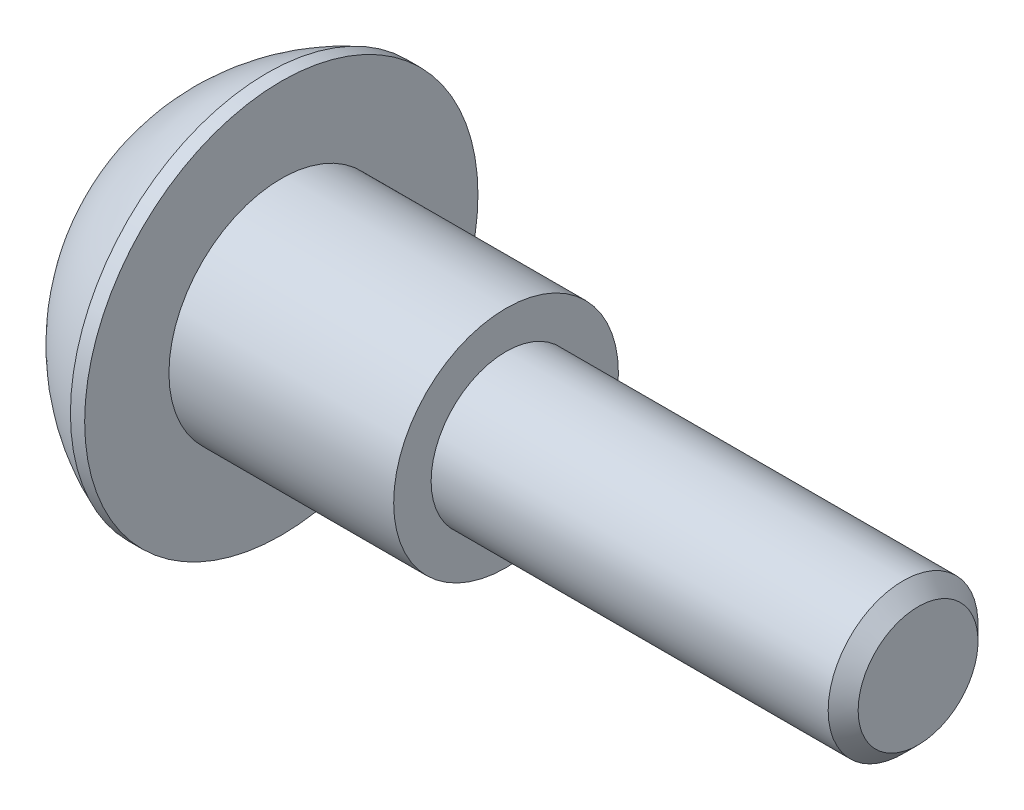
ISO-10303-21;
HEADER;
FILE_DESCRIPTION(('STEP AP214'),'2;1');
FILE_NAME('part.step','',(''),(''),'','','');
FILE_SCHEMA(('AUTOMOTIVE_DESIGN { 1 0 10303 214 1 1 1 1 }'));
ENDSEC;
DATA;
#1=APPLICATION_CONTEXT('core data for automotive mechanical design processes');
#2=APPLICATION_PROTOCOL_DEFINITION('international standard','automotive_design',2000,#1);
#3=PRODUCT_CONTEXT('',#1,'mechanical');
#4=PRODUCT('Part','Part','',(#3));
#5=PRODUCT_RELATED_PRODUCT_CATEGORY('part','',(#4));
#6=PRODUCT_DEFINITION_FORMATION('','',#4);
#7=PRODUCT_DEFINITION_CONTEXT('part definition',#1,'design');
#8=PRODUCT_DEFINITION('design','',#6,#7);
#9=PRODUCT_DEFINITION_SHAPE('','',#8);
#10=(LENGTH_UNIT() NAMED_UNIT(*) SI_UNIT(.MILLI.,.METRE.));
#11=(NAMED_UNIT(*) PLANE_ANGLE_UNIT() SI_UNIT($,.RADIAN.));
#12=(NAMED_UNIT(*) SI_UNIT($,.STERADIAN.) SOLID_ANGLE_UNIT());
#13=UNCERTAINTY_MEASURE_WITH_UNIT(LENGTH_MEASURE(1.E-05),#10,'distance_accuracy_value','');
#14=(GEOMETRIC_REPRESENTATION_CONTEXT(3) GLOBAL_UNCERTAINTY_ASSIGNED_CONTEXT((#13)) GLOBAL_UNIT_ASSIGNED_CONTEXT((#10,
#11,#12)) REPRESENTATION_CONTEXT('',''));
#15=CARTESIAN_POINT('',(0.,0.,0.));
#16=DIRECTION('',(0.,0.,1.));
#17=DIRECTION('',(1.,0.,0.));
#18=AXIS2_PLACEMENT_3D('',#15,#16,#17);
#19=CARTESIAN_POINT('',(0.,0.,0.));
#20=DIRECTION('',(-1.,0.,0.));
#21=DIRECTION('',(0.,0.,1.));
#22=AXIS2_PLACEMENT_3D('',#19,#20,#21);
#23=PLANE('',#22);
#24=CARTESIAN_POINT('',(0.,0.,0.));
#25=DIRECTION('',(-1.,0.,0.));
#26=DIRECTION('',(0.,0.,1.));
#27=AXIS2_PLACEMENT_3D('',#24,#25,#26);
#28=CIRCLE('',#27,2.625);
#29=CARTESIAN_POINT('',(0.,2.625,0.));
#30=VERTEX_POINT('',#29);
#31=EDGE_CURVE('E43',#30,#30,#28,.T.);
#32=ORIENTED_EDGE('',*,*,#31,.T.);
#33=EDGE_LOOP('',(#32));
#34=FACE_BOUND('',#33,.T.);
#35=DIRECTION('',(0.,-1.,0.));
#36=VECTOR('',#35,1.);
#37=CARTESIAN_POINT('',(0.,-1.15470053837925,2.));
#38=LINE('',#37,#36);
#39=CARTESIAN_POINT('',(0.,1.15470053837925,2.));
#40=VERTEX_POINT('',#39);
#41=CARTESIAN_POINT('',(0.,-1.15470053837925,2.));
#42=VERTEX_POINT('',#41);
#43=EDGE_CURVE('E50',#40,#42,#38,.T.);
#44=ORIENTED_EDGE('',*,*,#43,.T.);
#45=DIRECTION('',(0.,-0.500000000000001,-0.866025403784438));
#46=VECTOR('',#45,1.);
#47=CARTESIAN_POINT('',(0.,-2.3094010767585,0.));
#48=LINE('',#47,#46);
#49=CARTESIAN_POINT('',(0.,-2.3094010767585,0.));
#50=VERTEX_POINT('',#49);
#51=EDGE_CURVE('E158',#42,#50,#48,.T.);
#52=ORIENTED_EDGE('',*,*,#51,.T.);
#53=DIRECTION('',(0.,0.500000000000001,-0.866025403784438));
#54=VECTOR('',#53,1.);
#55=CARTESIAN_POINT('',(0.,-1.15470053837925,-2.));
#56=LINE('',#55,#54);
#57=CARTESIAN_POINT('',(0.,-1.15470053837925,-2.));
#58=VERTEX_POINT('',#57);
#59=EDGE_CURVE('E130',#50,#58,#56,.T.);
#60=ORIENTED_EDGE('',*,*,#59,.T.);
#61=DIRECTION('',(0.,1.,0.));
#62=VECTOR('',#61,1.);
#63=CARTESIAN_POINT('',(0.,1.15470053837925,-2.));
#64=LINE('',#63,#62);
#65=CARTESIAN_POINT('',(0.,1.15470053837925,-2.));
#66=VERTEX_POINT('',#65);
#67=EDGE_CURVE('E185',#58,#66,#64,.T.);
#68=ORIENTED_EDGE('',*,*,#67,.T.);
#69=DIRECTION('',(0.,0.5,0.866025403784439));
#70=VECTOR('',#69,1.);
#71=CARTESIAN_POINT('',(0.,2.3094010767585,0.));
#72=LINE('',#71,#70);
#73=CARTESIAN_POINT('',(0.,2.3094010767585,0.));
#74=VERTEX_POINT('',#73);
#75=EDGE_CURVE('E187',#66,#74,#72,.T.);
#76=ORIENTED_EDGE('',*,*,#75,.T.);
#77=DIRECTION('',(0.,-0.5,0.866025403784439));
#78=VECTOR('',#77,1.);
#79=CARTESIAN_POINT('',(0.,1.15470053837925,2.));
#80=LINE('',#79,#78);
#81=EDGE_CURVE('E189',#74,#40,#80,.T.);
#82=ORIENTED_EDGE('',*,*,#81,.T.);
#83=EDGE_LOOP('',(#44,#52,#60,#68,#76,#82));
#84=FACE_BOUND('',#83,.T.);
#85=ADVANCED_FACE('F36',(#34,#84),#23,.T.);
#86=CARTESIAN_POINT('',(4.99970462328768,0.,0.));
#87=DIRECTION('',(-1.,0.,0.));
#88=DIRECTION('',(0.,1.,0.));
#89=AXIS2_PLACEMENT_3D('',#86,#87,#88);
#90=SPHERICAL_SURFACE('',#89,5.64691697478581);
#91=CARTESIAN_POINT('',(2.92,0.,0.));
#92=DIRECTION('',(-1.,0.,0.));
#93=DIRECTION('',(0.,0.,1.));
#94=AXIS2_PLACEMENT_3D('',#91,#92,#93);
#95=CIRCLE('',#94,5.25);
#96=CARTESIAN_POINT('',(2.92,5.25,0.));
#97=VERTEX_POINT('',#96);
#98=EDGE_CURVE('E152',#97,#97,#95,.T.);
#99=CARTESIAN_POINT('',(2.92,5.25,0.));
#100=CARTESIAN_POINT('',(2.88116333139993,5.23461555496799,0.));
#101=CARTESIAN_POINT('',(2.84249743445724,5.21880002304115,0.));
#102=CARTESIAN_POINT('',(2.76552608609883,5.18631490596424,0.));
#103=CARTESIAN_POINT('',(2.72722063468312,5.16964532081416,0.));
#104=CARTESIAN_POINT('',(2.65098907959088,5.13546021785716,0.));
#105=CARTESIAN_POINT('',(2.61306297591435,5.11794470005024,0.));
#106=CARTESIAN_POINT('',(2.5376087841269,5.08207638165227,0.));
#107=CARTESIAN_POINT('',(2.50008069601598,5.06372358106122,0.));
#108=CARTESIAN_POINT('',(2.42544101991594,5.02618972911532,0.));
#109=CARTESIAN_POINT('',(2.38832943192683,5.00700867776048,0.));
#110=CARTESIAN_POINT('',(2.31454103209333,4.9678277722965,0.));
#111=CARTESIAN_POINT('',(2.27786422024896,4.94782791818736,0.));
#112=CARTESIAN_POINT('',(2.204963435524,4.90701925630078,0.));
#113=CARTESIAN_POINT('',(2.16873946264343,4.88621044852334,0.));
#114=CARTESIAN_POINT('',(2.09676219540546,4.84379412736126,0.));
#115=CARTESIAN_POINT('',(2.06100890104806,4.82218661397662,0.));
#116=CARTESIAN_POINT('',(1.9899905986814,4.77818352285276,0.));
#117=CARTESIAN_POINT('',(1.95472559067213,4.75578794511354,0.));
#118=CARTESIAN_POINT('',(1.88470122833741,4.7102197546814,0.));
#119=CARTESIAN_POINT('',(1.84994187401195,4.68704714198848,0.));
#120=CARTESIAN_POINT('',(1.78094593736053,4.63993629371345,0.));
#121=CARTESIAN_POINT('',(1.74670935503456,4.61599805813134,0.));
#122=CARTESIAN_POINT('',(1.67877582324134,4.56736775320002,0.));
#123=CARTESIAN_POINT('',(1.6450788737741,4.54267568385081,0.));
#124=CARTESIAN_POINT('',(1.57824120279908,4.4925498717552,0.));
#125=CARTESIAN_POINT('',(1.54510048129131,4.4671161290088,0.));
#126=CARTESIAN_POINT('',(1.4793915874043,4.4155194957489,0.));
#127=CARTESIAN_POINT('',(1.44682341502508,4.38935660523539,0.));
#128=CARTESIAN_POINT('',(1.3822756585948,4.33631456116252,0.));
#129=CARTESIAN_POINT('',(1.35029607454376,4.30943540760316,0.));
#130=CARTESIAN_POINT('',(1.28694124410103,4.2549740749057,0.));
#131=CARTESIAN_POINT('',(1.25556599770935,4.22739189576759,0.));
#132=CARTESIAN_POINT('',(1.19343529429185,4.17153809560631,0.));
#133=CARTESIAN_POINT('',(1.16267983726603,4.14326647458314,0.));
#134=CARTESIAN_POINT('',(1.10180385905236,4.0860477138823,0.));
#135=CARTESIAN_POINT('',(1.07168333786452,4.05710057420464,0.));
#136=CARTESIAN_POINT('',(1.01209206510523,3.99854503210539,0.));
#137=CARTESIAN_POINT('',(0.98262131353378,3.96893662968379,0.));
#138=CARTESIAN_POINT('',(0.924344093786627,3.90907314366641,0.));
#139=CARTESIAN_POINT('',(0.89553762561092,3.87881806007064,0.));
#140=CARTESIAN_POINT('',(0.838603159287822,3.8176761117527,0.));
#141=CARTESIAN_POINT('',(0.810475161140432,3.78678924703054,0.));
#142=CARTESIAN_POINT('',(0.754911487372879,3.72439894764781,0.));
#143=CARTESIAN_POINT('',(0.727475811752715,3.69289551298725,0.));
#144=CARTESIAN_POINT('',(0.673310294583733,3.62928758856414,0.));
#145=CARTESIAN_POINT('',(0.646580453034915,3.59718309880159,0.));
#146=CARTESIAN_POINT('',(0.59383976794017,3.53238887502059,0.));
#147=CARTESIAN_POINT('',(0.567828924394242,3.49969914100215,0.));
#148=CARTESIAN_POINT('',(0.516539045154726,3.43375052777114,0.));
#149=CARTESIAN_POINT('',(0.491260009461136,3.40049164855857,0.));
#150=CARTESIAN_POINT('',(0.441446195334815,3.33342112431611,0.));
#151=CARTESIAN_POINT('',(0.416911416902085,3.29960947928621,0.));
#152=CARTESIAN_POINT('',(0.368598200321405,3.23145007493057,0.));
#153=CARTESIAN_POINT('',(0.344819762173456,3.19710231560483,0.));
#154=CARTESIAN_POINT('',(0.298030936151543,3.12788759851044,0.));
#155=CARTESIAN_POINT('',(0.275020548277579,3.09302064074179,0.));
#156=CARTESIAN_POINT('',(0.229779156601618,3.02278469716988,0.));
#157=CARTESIAN_POINT('',(0.207548152799622,2.98741571136661,0.));
#158=CARTESIAN_POINT('',(0.163876471550351,2.91619313362712,0.));
#159=CARTESIAN_POINT('',(0.142435794103078,2.8803395416909,0.));
#160=CARTESIAN_POINT('',(0.100355347300806,2.80816539636944,0.));
#161=CARTESIAN_POINT('',(0.0797155779458086,2.7718448429842,0.));
#162=CARTESIAN_POINT('',(0.0392470276158933,2.69875470867178,0.));
#163=CARTESIAN_POINT('',(0.019418246640976,2.66198512774461,0.));
#164=CARTESIAN_POINT('',(0.,2.625,0.));
#165=B_SPLINE_CURVE_WITH_KNOTS('',3,(#99,#100,#101,#102,#103,#104,#105,#106,#107,#108,#109,#110,
#111,#112,#113,#114,#115,#116,#117,#118,#119,#120,#121,#122,#123,#124,#125,#126,#127,#128,#129,
#130,#131,#132,#133,#134,#135,#136,#137,#138,#139,#140,#141,#142,#143,#144,#145,#146,#147,#148,
#149,#150,#151,#152,#153,#154,#155,#156,#157,#158,#159,#160,#161,#162,#163,#164),.UNSPECIFIED.,
.F.,.F.,(4,2,2,2,2,2,2,2,2,2,2,2,2,2,2,2,2,2,2,2,2,2,2,2,2,2,2,2,2,2,2,2,4),(0.,
0.12531586463099,0.25063172926198,0.375947593892969,0.501263458523959,0.626579323154949,
0.751895187785939,0.877211052416929,1.00252691704792,1.12784278167891,1.2531586463099,
1.37847451094089,1.50379037557188,1.62910624020287,1.75442210483386,1.87973796946485,
2.00505383409584,2.13036969872683,2.25568556335782,2.38100142798881,2.5063172926198,
2.63163315725079,2.75694902188178,2.88226488651277,3.00758075114376,3.13289661577475,
3.25821248040574,3.38352834503673,3.50884420966772,3.63416007429871,3.7594759389297,
3.88479180356069,4.01010766819168),.UNSPECIFIED.);
#166=EDGE_CURVE('BSEAM249',#97,#30,#165,.T.);
#167=ORIENTED_EDGE('',*,*,#98,.T.);
#168=ORIENTED_EDGE('',*,*,#31,.F.);
#169=ORIENTED_EDGE('',*,*,#166,.T.);
#170=ORIENTED_EDGE('',*,*,#166,.F.);
#171=EDGE_LOOP('',(#167,#169,#168,#170));
#172=FACE_BOUND('',#171,.T.);
#173=ADVANCED_FACE('F249',(#172),#90,.T.);
#174=CARTESIAN_POINT('',(0.,0.,0.));
#175=DIRECTION('',(-1.,0.,0.));
#176=DIRECTION('',(0.,0.,1.));
#177=AXIS2_PLACEMENT_3D('',#174,#175,#176);
#178=CYLINDRICAL_SURFACE('',#177,5.25);
#179=ORIENTED_EDGE('',*,*,#98,.F.);
#180=EDGE_LOOP('',(#179));
#181=FACE_BOUND('',#180,.T.);
#182=CARTESIAN_POINT('',(3.3,0.,0.));
#183=DIRECTION('',(-1.,0.,0.));
#184=DIRECTION('',(0.,0.,1.));
#185=AXIS2_PLACEMENT_3D('',#182,#183,#184);
#186=CIRCLE('',#185,5.25);
#187=CARTESIAN_POINT('',(3.3,0.,5.25));
#188=VERTEX_POINT('',#187);
#189=EDGE_CURVE('E149',#188,#188,#186,.T.);
#190=ORIENTED_EDGE('',*,*,#189,.T.);
#191=EDGE_LOOP('',(#190));
#192=FACE_BOUND('',#191,.T.);
#193=ADVANCED_FACE('F254',(#181,#192),#178,.T.);
#194=CARTESIAN_POINT('',(3.3,2.,0.));
#195=DIRECTION('',(-1.,0.,0.));
#196=DIRECTION('',(0.,0.,1.));
#197=AXIS2_PLACEMENT_3D('',#194,#195,#196);
#198=PLANE('',#197);
#199=CARTESIAN_POINT('',(3.3,0.,0.));
#200=DIRECTION('',(-1.,0.,0.));
#201=DIRECTION('',(0.,0.,1.));
#202=AXIS2_PLACEMENT_3D('',#199,#200,#201);
#203=CIRCLE('',#202,3.);
#204=CARTESIAN_POINT('',(3.3,0.,3.));
#205=VERTEX_POINT('',#204);
#206=EDGE_CURVE('E11',#205,#205,#203,.F.);
#207=ORIENTED_EDGE('',*,*,#206,.F.);
#208=EDGE_LOOP('',(#207));
#209=FACE_BOUND('',#208,.T.);
#210=ORIENTED_EDGE('',*,*,#189,.F.);
#211=EDGE_LOOP('',(#210));
#212=FACE_BOUND('',#211,.T.);
#213=ADVANCED_FACE('F261',(#209,#212),#198,.F.);
#214=CARTESIAN_POINT('',(2.08,-2.3094010767585,0.));
#215=DIRECTION('',(0.,0.866025403784438,-0.500000000000001));
#216=DIRECTION('',(0.,0.500000000000001,0.866025403784438));
#217=AXIS2_PLACEMENT_3D('',#214,#215,#216);
#218=PLANE('',#217);
#219=DIRECTION('',(0.,-0.500000000000001,-0.866025403784438));
#220=VECTOR('',#219,1.);
#221=CARTESIAN_POINT('',(2.08,-2.3094010767585,0.));
#222=LINE('',#221,#220);
#223=CARTESIAN_POINT('',(2.08,-1.15470053837925,2.));
#224=VERTEX_POINT('',#223);
#225=CARTESIAN_POINT('',(2.08,-1.73205080756888,1.));
#226=VERTEX_POINT('',#225);
#227=EDGE_CURVE('E116',#224,#226,#222,.T.);
#228=ORIENTED_EDGE('',*,*,#227,.T.);
#229=CARTESIAN_POINT('',(2.08,-2.3094010767585,0.));
#230=VERTEX_POINT('',#229);
#231=EDGE_CURVE('E111',#226,#230,#222,.T.);
#232=ORIENTED_EDGE('',*,*,#231,.T.);
#233=DIRECTION('',(-1.,0.,0.));
#234=VECTOR('',#233,1.);
#235=CARTESIAN_POINT('',(2.08,-2.3094010767585,0.));
#236=LINE('',#235,#234);
#237=EDGE_CURVE('E113',#230,#50,#236,.T.);
#238=ORIENTED_EDGE('',*,*,#237,.T.);
#239=ORIENTED_EDGE('',*,*,#51,.F.);
#240=DIRECTION('',(-1.,0.,0.));
#241=VECTOR('',#240,1.);
#242=CARTESIAN_POINT('',(2.08,-1.15470053837925,2.));
#243=LINE('',#242,#241);
#244=EDGE_CURVE('E182',#224,#42,#243,.T.);
#245=ORIENTED_EDGE('',*,*,#244,.F.);
#246=EDGE_LOOP('',(#228,#232,#238,#239,#245));
#247=FACE_BOUND('',#246,.T.);
#248=ADVANCED_FACE('F112',(#247),#218,.T.);
#249=CARTESIAN_POINT('',(2.08,-1.15470053837925,-2.));
#250=DIRECTION('',(0.,0.866025403784438,0.500000000000001));
#251=DIRECTION('',(0.,-0.500000000000001,0.866025403784438));
#252=AXIS2_PLACEMENT_3D('',#249,#250,#251);
#253=PLANE('',#252);
#254=DIRECTION('',(0.,0.500000000000001,-0.866025403784438));
#255=VECTOR('',#254,1.);
#256=CARTESIAN_POINT('',(2.08,-1.15470053837925,-2.));
#257=LINE('',#256,#255);
#258=CARTESIAN_POINT('',(2.08,-1.73205080756888,-1.));
#259=VERTEX_POINT('',#258);
#260=EDGE_CURVE('E58',#230,#259,#257,.T.);
#261=ORIENTED_EDGE('',*,*,#260,.T.);
#262=CARTESIAN_POINT('',(2.08,-1.15470053837925,-2.));
#263=VERTEX_POINT('',#262);
#264=EDGE_CURVE('E125',#259,#263,#257,.T.);
#265=ORIENTED_EDGE('',*,*,#264,.T.);
#266=DIRECTION('',(-1.,0.,0.));
#267=VECTOR('',#266,1.);
#268=CARTESIAN_POINT('',(2.08,-1.15470053837925,-2.));
#269=LINE('',#268,#267);
#270=EDGE_CURVE('E132',#263,#58,#269,.T.);
#271=ORIENTED_EDGE('',*,*,#270,.T.);
#272=ORIENTED_EDGE('',*,*,#59,.F.);
#273=ORIENTED_EDGE('',*,*,#237,.F.);
#274=EDGE_LOOP('',(#261,#265,#271,#272,#273));
#275=FACE_BOUND('',#274,.T.);
#276=ADVANCED_FACE('F128',(#275),#253,.T.);
#277=CARTESIAN_POINT('',(2.08,1.15470053837925,-2.));
#278=DIRECTION('',(0.,0.,1.));
#279=DIRECTION('',(1.,0.,0.));
#280=AXIS2_PLACEMENT_3D('',#277,#278,#279);
#281=PLANE('',#280);
#282=DIRECTION('',(0.,1.,0.));
#283=VECTOR('',#282,1.);
#284=CARTESIAN_POINT('',(2.08,1.15470053837925,-2.));
#285=LINE('',#284,#283);
#286=CARTESIAN_POINT('',(2.08,0.,-2.));
#287=VERTEX_POINT('',#286);
#288=EDGE_CURVE('E168',#263,#287,#285,.T.);
#289=ORIENTED_EDGE('',*,*,#288,.T.);
#290=CARTESIAN_POINT('',(2.08,1.15470053837925,-2.));
#291=VERTEX_POINT('',#290);
#292=EDGE_CURVE('E124',#287,#291,#285,.T.);
#293=ORIENTED_EDGE('',*,*,#292,.T.);
#294=DIRECTION('',(-1.,0.,0.));
#295=VECTOR('',#294,1.);
#296=CARTESIAN_POINT('',(2.08,1.15470053837925,-2.));
#297=LINE('',#296,#295);
#298=EDGE_CURVE('E137',#291,#66,#297,.T.);
#299=ORIENTED_EDGE('',*,*,#298,.T.);
#300=ORIENTED_EDGE('',*,*,#67,.F.);
#301=ORIENTED_EDGE('',*,*,#270,.F.);
#302=EDGE_LOOP('',(#289,#293,#299,#300,#301));
#303=FACE_BOUND('',#302,.T.);
#304=ADVANCED_FACE('F204',(#303),#281,.T.);
#305=CARTESIAN_POINT('',(2.08,2.3094010767585,0.));
#306=DIRECTION('',(0.,-0.866025403784439,0.5));
#307=DIRECTION('',(0.,-0.5,-0.866025403784439));
#308=AXIS2_PLACEMENT_3D('',#305,#306,#307);
#309=PLANE('',#308);
#310=DIRECTION('',(0.,0.5,0.866025403784439));
#311=VECTOR('',#310,1.);
#312=CARTESIAN_POINT('',(2.08,2.3094010767585,0.));
#313=LINE('',#312,#311);
#314=CARTESIAN_POINT('',(2.08,1.73205080756888,-1.));
#315=VERTEX_POINT('',#314);
#316=EDGE_CURVE('E172',#291,#315,#313,.T.);
#317=ORIENTED_EDGE('',*,*,#316,.T.);
#318=CARTESIAN_POINT('',(2.08,2.3094010767585,0.));
#319=VERTEX_POINT('',#318);
#320=EDGE_CURVE('E171',#315,#319,#313,.T.);
#321=ORIENTED_EDGE('',*,*,#320,.T.);
#322=DIRECTION('',(-1.,0.,0.));
#323=VECTOR('',#322,1.);
#324=CARTESIAN_POINT('',(2.08,2.3094010767585,0.));
#325=LINE('',#324,#323);
#326=EDGE_CURVE('E197',#319,#74,#325,.T.);
#327=ORIENTED_EDGE('',*,*,#326,.T.);
#328=ORIENTED_EDGE('',*,*,#75,.F.);
#329=ORIENTED_EDGE('',*,*,#298,.F.);
#330=EDGE_LOOP('',(#317,#321,#327,#328,#329));
#331=FACE_BOUND('',#330,.T.);
#332=ADVANCED_FACE('F209',(#331),#309,.T.);
#333=CARTESIAN_POINT('',(2.08,1.15470053837925,2.));
#334=DIRECTION('',(0.,-0.866025403784439,-0.5));
#335=DIRECTION('',(0.,0.5,-0.866025403784439));
#336=AXIS2_PLACEMENT_3D('',#333,#334,#335);
#337=PLANE('',#336);
#338=DIRECTION('',(0.,-0.5,0.866025403784439));
#339=VECTOR('',#338,1.);
#340=CARTESIAN_POINT('',(2.08,1.15470053837925,2.));
#341=LINE('',#340,#339);
#342=CARTESIAN_POINT('',(2.08,1.73205080756888,1.));
#343=VERTEX_POINT('',#342);
#344=EDGE_CURVE('E176',#319,#343,#341,.T.);
#345=ORIENTED_EDGE('',*,*,#344,.T.);
#346=CARTESIAN_POINT('',(2.08,1.15470053837925,2.));
#347=VERTEX_POINT('',#346);
#348=EDGE_CURVE('E175',#343,#347,#341,.T.);
#349=ORIENTED_EDGE('',*,*,#348,.T.);
#350=DIRECTION('',(-1.,0.,0.));
#351=VECTOR('',#350,1.);
#352=CARTESIAN_POINT('',(2.08,1.15470053837925,2.));
#353=LINE('',#352,#351);
#354=EDGE_CURVE('E194',#347,#40,#353,.T.);
#355=ORIENTED_EDGE('',*,*,#354,.T.);
#356=ORIENTED_EDGE('',*,*,#81,.F.);
#357=ORIENTED_EDGE('',*,*,#326,.F.);
#358=EDGE_LOOP('',(#345,#349,#355,#356,#357));
#359=FACE_BOUND('',#358,.T.);
#360=ADVANCED_FACE('F235',(#359),#337,.T.);
#361=CARTESIAN_POINT('',(2.08,-1.15470053837925,2.));
#362=DIRECTION('',(0.,0.,-1.));
#363=DIRECTION('',(0.,1.,0.));
#364=AXIS2_PLACEMENT_3D('',#361,#362,#363);
#365=PLANE('',#364);
#366=DIRECTION('',(0.,-1.,0.));
#367=VECTOR('',#366,1.);
#368=CARTESIAN_POINT('',(2.08,-1.15470053837925,2.));
#369=LINE('',#368,#367);
#370=CARTESIAN_POINT('',(2.08,0.,2.));
#371=VERTEX_POINT('',#370);
#372=EDGE_CURVE('E180',#347,#371,#369,.T.);
#373=ORIENTED_EDGE('',*,*,#372,.T.);
#374=EDGE_CURVE('E179',#371,#224,#369,.T.);
#375=ORIENTED_EDGE('',*,*,#374,.T.);
#376=ORIENTED_EDGE('',*,*,#244,.T.);
#377=ORIENTED_EDGE('',*,*,#43,.F.);
#378=ORIENTED_EDGE('',*,*,#354,.F.);
#379=EDGE_LOOP('',(#373,#375,#376,#377,#378));
#380=FACE_BOUND('',#379,.T.);
#381=ADVANCED_FACE('F237',(#380),#365,.T.);
#382=CARTESIAN_POINT('',(2.08,-2.30940107675851,0.));
#383=DIRECTION('',(1.,0.,0.));
#384=DIRECTION('',(0.,0.,-1.));
#385=AXIS2_PLACEMENT_3D('',#382,#383,#384);
#386=PLANE('',#385);
#387=CARTESIAN_POINT('',(2.08,0.,0.));
#388=DIRECTION('',(-1.,0.,0.));
#389=DIRECTION('',(0.,0.,1.));
#390=AXIS2_PLACEMENT_3D('',#387,#388,#389);
#391=CIRCLE('',#390,2.);
#392=EDGE_CURVE('E218',#315,#287,#391,.T.);
#393=ORIENTED_EDGE('',*,*,#392,.F.);
#394=ORIENTED_EDGE('',*,*,#316,.F.);
#395=ORIENTED_EDGE('',*,*,#292,.F.);
#396=EDGE_LOOP('',(#393,#394,#395));
#397=FACE_BOUND('',#396,.T.);
#398=ADVANCED_FACE('F220',(#397),#386,.F.);
#399=EDGE_CURVE('E143',#343,#315,#391,.T.);
#400=ORIENTED_EDGE('',*,*,#399,.F.);
#401=ORIENTED_EDGE('',*,*,#344,.F.);
#402=ORIENTED_EDGE('',*,*,#320,.F.);
#403=EDGE_LOOP('',(#400,#401,#402));
#404=FACE_BOUND('',#403,.T.);
#405=ADVANCED_FACE('F228',(#404),#386,.F.);
#406=EDGE_CURVE('E136',#371,#343,#391,.T.);
#407=ORIENTED_EDGE('',*,*,#406,.F.);
#408=ORIENTED_EDGE('',*,*,#372,.F.);
#409=ORIENTED_EDGE('',*,*,#348,.F.);
#410=EDGE_LOOP('',(#407,#408,#409));
#411=FACE_BOUND('',#410,.T.);
#412=ADVANCED_FACE('F231',(#411),#386,.F.);
#413=EDGE_CURVE('E131',#226,#371,#391,.T.);
#414=ORIENTED_EDGE('',*,*,#413,.F.);
#415=ORIENTED_EDGE('',*,*,#227,.F.);
#416=ORIENTED_EDGE('',*,*,#374,.F.);
#417=EDGE_LOOP('',(#414,#415,#416));
#418=FACE_BOUND('',#417,.T.);
#419=ADVANCED_FACE('F239',(#418),#386,.F.);
#420=EDGE_CURVE('E122',#259,#226,#391,.T.);
#421=ORIENTED_EDGE('',*,*,#420,.F.);
#422=ORIENTED_EDGE('',*,*,#260,.F.);
#423=ORIENTED_EDGE('',*,*,#231,.F.);
#424=EDGE_LOOP('',(#421,#422,#423));
#425=FACE_BOUND('',#424,.T.);
#426=ADVANCED_FACE('F121',(#425),#386,.F.);
#427=EDGE_CURVE('E216',#287,#259,#391,.T.);
#428=ORIENTED_EDGE('',*,*,#427,.F.);
#429=ORIENTED_EDGE('',*,*,#288,.F.);
#430=ORIENTED_EDGE('',*,*,#264,.F.);
#431=EDGE_LOOP('',(#428,#429,#430));
#432=FACE_BOUND('',#431,.T.);
#433=ADVANCED_FACE('F215',(#432),#386,.F.);
#434=CARTESIAN_POINT('',(3.23470053837926,0.,0.));
#435=DIRECTION('',(-1.,0.,0.));
#436=DIRECTION('',(0.,0.,1.));
#437=AXIS2_PLACEMENT_3D('',#434,#435,#436);
#438=CONICAL_SURFACE('',#437,0.,1.04719755119659);
#439=ORIENTED_EDGE('',*,*,#406,.T.);
#440=ORIENTED_EDGE('',*,*,#399,.T.);
#441=ORIENTED_EDGE('',*,*,#392,.T.);
#442=ORIENTED_EDGE('',*,*,#427,.T.);
#443=ORIENTED_EDGE('',*,*,#420,.T.);
#444=ORIENTED_EDGE('',*,*,#413,.T.);
#445=EDGE_LOOP('',(#439,#440,#441,#442,#443,#444));
#446=FACE_BOUND('',#445,.T.);
#447=CARTESIAN_POINT('',(3.23470053837926,0.,0.));
#448=VERTEX_POINT('',#447);
#449=VERTEX_LOOP('',#448);
#450=FACE_BOUND('',#449,.T.);
#451=ADVANCED_FACE('F223',(#446,#450),#438,.F.);
#452=CARTESIAN_POINT('',(9.3,0.,0.));
#453=DIRECTION('',(-1.,0.,0.));
#454=DIRECTION('',(0.,0.,1.));
#455=AXIS2_PLACEMENT_3D('',#452,#453,#454);
#456=CYLINDRICAL_SURFACE('',#455,3.);
#457=CARTESIAN_POINT('',(9.3,0.,0.));
#458=DIRECTION('',(1.,0.,0.));
#459=DIRECTION('',(0.,0.,-1.));
#460=AXIS2_PLACEMENT_3D('',#457,#458,#459);
#461=CIRCLE('',#460,3.);
#462=CARTESIAN_POINT('',(9.3,0.,-3.));
#463=VERTEX_POINT('',#462);
#464=EDGE_CURVE('E159',#463,#463,#461,.T.);
#465=ORIENTED_EDGE('',*,*,#464,.F.);
#466=EDGE_LOOP('',(#465));
#467=FACE_BOUND('',#466,.T.);
#468=ORIENTED_EDGE('',*,*,#206,.T.);
#469=EDGE_LOOP('',(#468));
#470=FACE_BOUND('',#469,.T.);
#471=ADVANCED_FACE('F282',(#467,#470),#456,.T.);
#472=CARTESIAN_POINT('',(9.3,0.,0.));
#473=DIRECTION('',(1.,0.,0.));
#474=DIRECTION('',(0.,0.,-1.));
#475=AXIS2_PLACEMENT_3D('',#472,#473,#474);
#476=PLANE('',#475);
#477=CARTESIAN_POINT('',(9.3,0.,0.));
#478=DIRECTION('',(1.,0.,0.));
#479=DIRECTION('',(0.,0.,-1.));
#480=AXIS2_PLACEMENT_3D('',#477,#478,#479);
#481=CIRCLE('',#480,2.);
#482=CARTESIAN_POINT('',(9.3,0.,-2.));
#483=VERTEX_POINT('',#482);
#484=EDGE_CURVE('E156',#483,#483,#481,.T.);
#485=ORIENTED_EDGE('',*,*,#484,.F.);
#486=EDGE_LOOP('',(#485));
#487=FACE_BOUND('',#486,.T.);
#488=ORIENTED_EDGE('',*,*,#464,.T.);
#489=EDGE_LOOP('',(#488));
#490=FACE_BOUND('',#489,.T.);
#491=ADVANCED_FACE('F278',(#487,#490),#476,.T.);
#492=CARTESIAN_POINT('',(20.3,0.,0.));
#493=DIRECTION('',(-1.,0.,0.));
#494=DIRECTION('',(0.,0.,1.));
#495=AXIS2_PLACEMENT_3D('',#492,#493,#494);
#496=PLANE('',#495);
#497=CARTESIAN_POINT('',(20.3,0.,0.));
#498=DIRECTION('',(-1.,0.,0.));
#499=DIRECTION('',(0.,0.,1.));
#500=AXIS2_PLACEMENT_3D('',#497,#498,#499);
#501=CIRCLE('',#500,1.6);
#502=CARTESIAN_POINT('',(20.3,0.,1.6));
#503=VERTEX_POINT('',#502);
#504=EDGE_CURVE('E142',#503,#503,#501,.T.);
#505=ORIENTED_EDGE('',*,*,#504,.F.);
#506=EDGE_LOOP('',(#505));
#507=FACE_BOUND('',#506,.T.);
#508=ADVANCED_FACE('F274',(#507),#496,.F.);
#509=CARTESIAN_POINT('',(20.3,0.,0.));
#510=DIRECTION('',(-1.,0.,0.));
#511=DIRECTION('',(0.,0.,1.));
#512=AXIS2_PLACEMENT_3D('',#509,#510,#511);
#513=CONICAL_SURFACE('',#512,1.6,0.785398163397448);
#514=CARTESIAN_POINT('',(19.9,0.,0.));
#515=DIRECTION('',(-1.,0.,0.));
#516=DIRECTION('',(0.,0.,1.));
#517=AXIS2_PLACEMENT_3D('',#514,#515,#516);
#518=CIRCLE('',#517,2.);
#519=CARTESIAN_POINT('',(19.9,0.,2.));
#520=VERTEX_POINT('',#519);
#521=EDGE_CURVE('E146',#520,#520,#518,.T.);
#522=ORIENTED_EDGE('',*,*,#521,.F.);
#523=EDGE_LOOP('',(#522));
#524=FACE_BOUND('',#523,.T.);
#525=ORIENTED_EDGE('',*,*,#504,.T.);
#526=EDGE_LOOP('',(#525));
#527=FACE_BOUND('',#526,.T.);
#528=ADVANCED_FACE('F271',(#524,#527),#513,.T.);
#529=CARTESIAN_POINT('',(0.,0.,0.));
#530=DIRECTION('',(-1.,0.,0.));
#531=DIRECTION('',(0.,0.,1.));
#532=AXIS2_PLACEMENT_3D('',#529,#530,#531);
#533=CYLINDRICAL_SURFACE('',#532,2.);
#534=ORIENTED_EDGE('',*,*,#484,.T.);
#535=EDGE_LOOP('',(#534));
#536=FACE_BOUND('',#535,.T.);
#537=ORIENTED_EDGE('',*,*,#521,.T.);
#538=EDGE_LOOP('',(#537));
#539=FACE_BOUND('',#538,.T.);
#540=ADVANCED_FACE('F268',(#536,#539),#533,.T.);
#541=CLOSED_SHELL('',(#85,#173,#193,#213,#248,#276,#304,#332,#360,#381,#398,#405,#412,#419,#426,
#433,#451,#471,#491,#508,#528,#540));
#542=MANIFOLD_SOLID_BREP('B2',#541);
#543=ADVANCED_BREP_SHAPE_REPRESENTATION('',(#18,#542),#14);
#544=SHAPE_DEFINITION_REPRESENTATION(#9,#543);
ENDSEC;
END-ISO-10303-21;
